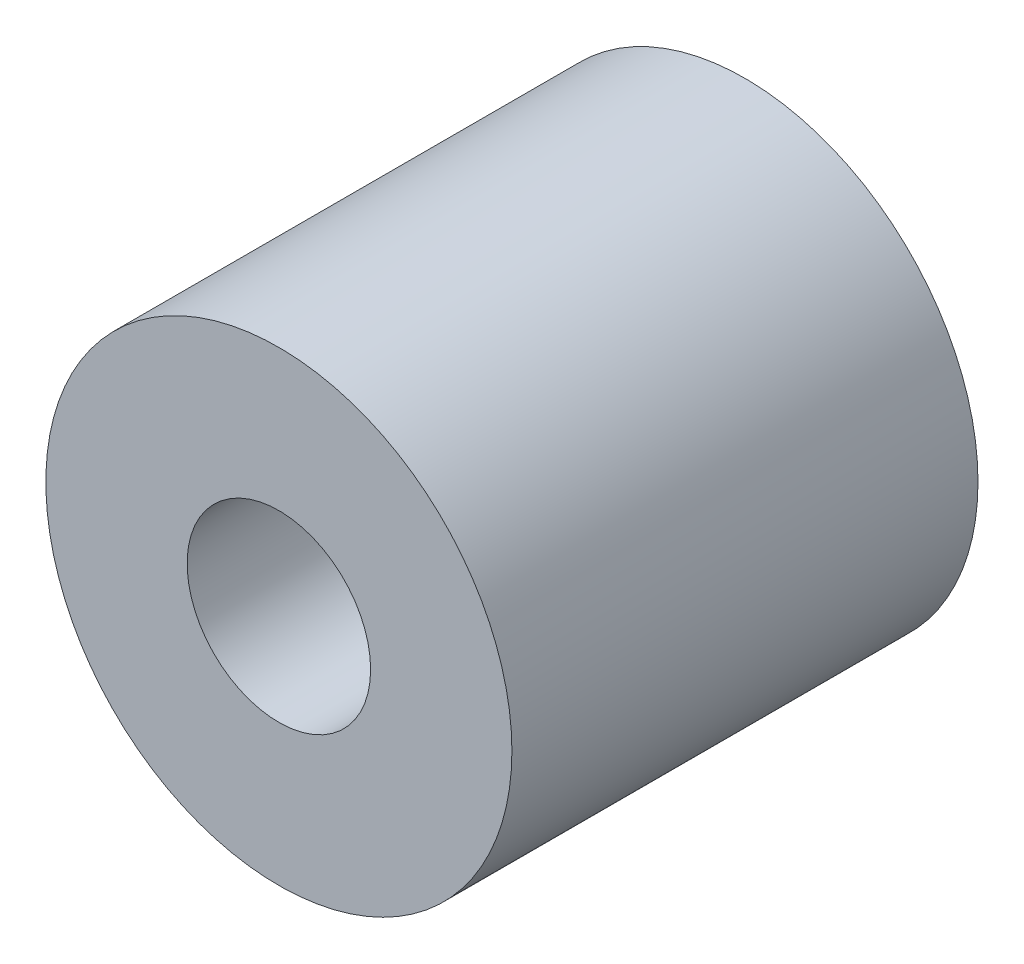
ISO-10303-21;
HEADER;
FILE_DESCRIPTION(('STEP AP214'),'2;1');
FILE_NAME('part.step','',(''),(''),'','','');
FILE_SCHEMA(('AUTOMOTIVE_DESIGN { 1 0 10303 214 1 1 1 1 }'));
ENDSEC;
DATA;
#1=APPLICATION_CONTEXT('core data for automotive mechanical design processes');
#2=APPLICATION_PROTOCOL_DEFINITION('international standard','automotive_design',2000,#1);
#3=PRODUCT_CONTEXT('',#1,'mechanical');
#4=PRODUCT('Part','Part','',(#3));
#5=PRODUCT_RELATED_PRODUCT_CATEGORY('part','',(#4));
#6=PRODUCT_DEFINITION_FORMATION('','',#4);
#7=PRODUCT_DEFINITION_CONTEXT('part definition',#1,'design');
#8=PRODUCT_DEFINITION('design','',#6,#7);
#9=PRODUCT_DEFINITION_SHAPE('','',#8);
#10=(LENGTH_UNIT() NAMED_UNIT(*) SI_UNIT(.MILLI.,.METRE.));
#11=(NAMED_UNIT(*) PLANE_ANGLE_UNIT() SI_UNIT($,.RADIAN.));
#12=(NAMED_UNIT(*) SI_UNIT($,.STERADIAN.) SOLID_ANGLE_UNIT());
#13=UNCERTAINTY_MEASURE_WITH_UNIT(LENGTH_MEASURE(1.E-05),#10,'distance_accuracy_value','');
#14=(GEOMETRIC_REPRESENTATION_CONTEXT(3) GLOBAL_UNCERTAINTY_ASSIGNED_CONTEXT((#13)) GLOBAL_UNIT_ASSIGNED_CONTEXT((#10,
#11,#12)) REPRESENTATION_CONTEXT('',''));
#15=CARTESIAN_POINT('',(0.,0.,0.));
#16=DIRECTION('',(0.,0.,1.));
#17=DIRECTION('',(1.,0.,0.));
#18=AXIS2_PLACEMENT_3D('',#15,#16,#17);
#19=CARTESIAN_POINT('',(0.,0.,12.7));
#20=DIRECTION('',(0.,0.,1.));
#21=DIRECTION('',(1.,0.,0.));
#22=AXIS2_PLACEMENT_3D('',#19,#20,#21);
#23=PLANE('',#22);
#24=CARTESIAN_POINT('',(0.,0.,12.7));
#25=DIRECTION('',(0.,0.,1.));
#26=DIRECTION('',(1.,0.,0.));
#27=AXIS2_PLACEMENT_3D('',#24,#25,#26);
#28=CIRCLE('',#27,6.35);
#29=CARTESIAN_POINT('',(6.35,0.,12.7));
#30=VERTEX_POINT('',#29);
#31=EDGE_CURVE('E10',#30,#30,#28,.T.);
#32=ORIENTED_EDGE('',*,*,#31,.T.);
#33=EDGE_LOOP('',(#32));
#34=FACE_BOUND('',#33,.T.);
#35=CARTESIAN_POINT('',(0.,0.,12.7));
#36=DIRECTION('',(0.,0.,1.));
#37=DIRECTION('',(1.,0.,0.));
#38=AXIS2_PLACEMENT_3D('',#35,#36,#37);
#39=CIRCLE('',#38,2.499995);
#40=CARTESIAN_POINT('',(2.499995,0.,12.7));
#41=VERTEX_POINT('',#40);
#42=EDGE_CURVE('E56',#41,#41,#39,.T.);
#43=ORIENTED_EDGE('',*,*,#42,.F.);
#44=EDGE_LOOP('',(#43));
#45=FACE_BOUND('',#44,.T.);
#46=ADVANCED_FACE('F43',(#34,#45),#23,.T.);
#47=CARTESIAN_POINT('',(0.,0.,0.));
#48=DIRECTION('',(0.,0.,1.));
#49=DIRECTION('',(1.,0.,0.));
#50=AXIS2_PLACEMENT_3D('',#47,#48,#49);
#51=PLANE('',#50);
#52=CARTESIAN_POINT('',(0.,0.,0.));
#53=DIRECTION('',(0.,0.,1.));
#54=DIRECTION('',(1.,0.,0.));
#55=AXIS2_PLACEMENT_3D('',#52,#53,#54);
#56=CIRCLE('',#55,6.35);
#57=CARTESIAN_POINT('',(6.35,0.,0.));
#58=VERTEX_POINT('',#57);
#59=EDGE_CURVE('E47',#58,#58,#56,.T.);
#60=ORIENTED_EDGE('',*,*,#59,.F.);
#61=EDGE_LOOP('',(#60));
#62=FACE_BOUND('',#61,.T.);
#63=CARTESIAN_POINT('',(0.,0.,0.));
#64=DIRECTION('',(0.,0.,1.));
#65=DIRECTION('',(1.,0.,0.));
#66=AXIS2_PLACEMENT_3D('',#63,#64,#65);
#67=CIRCLE('',#66,2.499995);
#68=CARTESIAN_POINT('',(2.499995,0.,0.));
#69=VERTEX_POINT('',#68);
#70=EDGE_CURVE('E58',#69,#69,#67,.T.);
#71=ORIENTED_EDGE('',*,*,#70,.T.);
#72=EDGE_LOOP('',(#71));
#73=FACE_BOUND('',#72,.T.);
#74=ADVANCED_FACE('F70',(#62,#73),#51,.F.);
#75=CARTESIAN_POINT('',(0.,0.,12.7));
#76=DIRECTION('',(0.,0.,-1.));
#77=DIRECTION('',(-1.,0.,0.));
#78=AXIS2_PLACEMENT_3D('',#75,#76,#77);
#79=CYLINDRICAL_SURFACE('',#78,6.35);
#80=ORIENTED_EDGE('',*,*,#31,.F.);
#81=EDGE_LOOP('',(#80));
#82=FACE_BOUND('',#81,.T.);
#83=ORIENTED_EDGE('',*,*,#59,.T.);
#84=EDGE_LOOP('',(#83));
#85=FACE_BOUND('',#84,.T.);
#86=ADVANCED_FACE('F45',(#82,#85),#79,.T.);
#87=CARTESIAN_POINT('',(0.,0.,12.7));
#88=DIRECTION('',(0.,0.,-1.));
#89=DIRECTION('',(-1.,0.,0.));
#90=AXIS2_PLACEMENT_3D('',#87,#88,#89);
#91=CYLINDRICAL_SURFACE('',#90,2.499995);
#92=ORIENTED_EDGE('',*,*,#42,.T.);
#93=EDGE_LOOP('',(#92));
#94=FACE_BOUND('',#93,.T.);
#95=ORIENTED_EDGE('',*,*,#70,.F.);
#96=EDGE_LOOP('',(#95));
#97=FACE_BOUND('',#96,.T.);
#98=ADVANCED_FACE('F66',(#94,#97),#91,.F.);
#99=CLOSED_SHELL('',(#46,#74,#86,#98));
#100=MANIFOLD_SOLID_BREP('B2',#99);
#101=ADVANCED_BREP_SHAPE_REPRESENTATION('',(#18,#100),#14);
#102=SHAPE_DEFINITION_REPRESENTATION(#9,#101);
ENDSEC;
END-ISO-10303-21;
